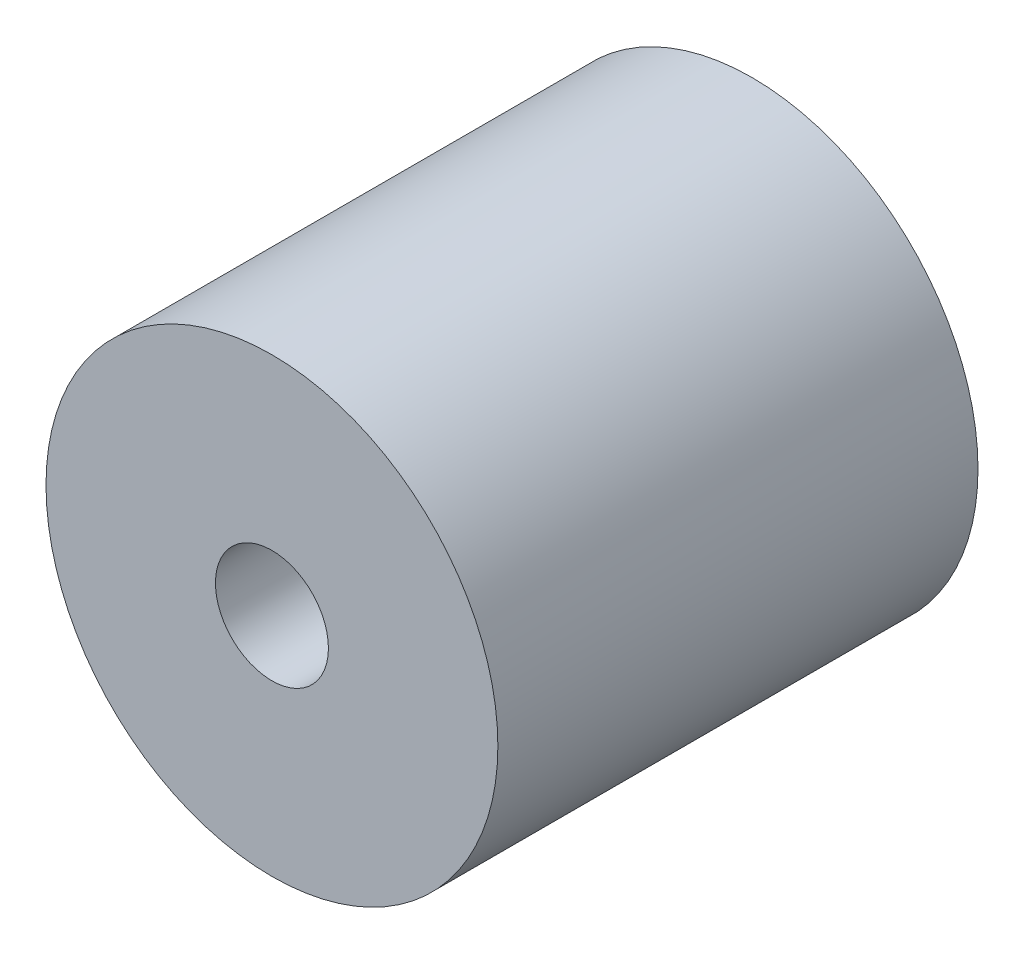
ISO-10303-21;
HEADER;
FILE_DESCRIPTION(('STEP AP214'),'2;1');
FILE_NAME('part.step','',(''),(''),'','','');
FILE_SCHEMA(('AUTOMOTIVE_DESIGN { 1 0 10303 214 1 1 1 1 }'));
ENDSEC;
DATA;
#1=APPLICATION_CONTEXT('core data for automotive mechanical design processes');
#2=APPLICATION_PROTOCOL_DEFINITION('international standard','automotive_design',2000,#1);
#3=PRODUCT_CONTEXT('',#1,'mechanical');
#4=PRODUCT('Part','Part','',(#3));
#5=PRODUCT_RELATED_PRODUCT_CATEGORY('part','',(#4));
#6=PRODUCT_DEFINITION_FORMATION('','',#4);
#7=PRODUCT_DEFINITION_CONTEXT('part definition',#1,'design');
#8=PRODUCT_DEFINITION('design','',#6,#7);
#9=PRODUCT_DEFINITION_SHAPE('','',#8);
#10=(LENGTH_UNIT() NAMED_UNIT(*) SI_UNIT(.MILLI.,.METRE.));
#11=(NAMED_UNIT(*) PLANE_ANGLE_UNIT() SI_UNIT($,.RADIAN.));
#12=(NAMED_UNIT(*) SI_UNIT($,.STERADIAN.) SOLID_ANGLE_UNIT());
#13=UNCERTAINTY_MEASURE_WITH_UNIT(LENGTH_MEASURE(1.E-05),#10,'distance_accuracy_value','');
#14=(GEOMETRIC_REPRESENTATION_CONTEXT(3) GLOBAL_UNCERTAINTY_ASSIGNED_CONTEXT((#13)) GLOBAL_UNIT_ASSIGNED_CONTEXT((#10,
#11,#12)) REPRESENTATION_CONTEXT('',''));
#15=CARTESIAN_POINT('',(0.,0.,0.));
#16=DIRECTION('',(0.,0.,1.));
#17=DIRECTION('',(1.,0.,0.));
#18=AXIS2_PLACEMENT_3D('',#15,#16,#17);
#19=CARTESIAN_POINT('',(0.,0.,8.5));
#20=DIRECTION('',(0.,0.,-1.));
#21=DIRECTION('',(-1.,0.,0.));
#22=AXIS2_PLACEMENT_3D('',#19,#20,#21);
#23=CYLINDRICAL_SURFACE('',#22,4.);
#24=CARTESIAN_POINT('',(0.,0.,8.5));
#25=DIRECTION('',(0.,0.,1.));
#26=DIRECTION('',(1.,0.,0.));
#27=AXIS2_PLACEMENT_3D('',#24,#25,#26);
#28=CIRCLE('',#27,4.);
#29=CARTESIAN_POINT('',(4.,0.,8.5));
#30=VERTEX_POINT('',#29);
#31=EDGE_CURVE('E10',#30,#30,#28,.T.);
#32=ORIENTED_EDGE('',*,*,#31,.F.);
#33=EDGE_LOOP('',(#32));
#34=FACE_BOUND('',#33,.T.);
#35=CARTESIAN_POINT('',(0.,0.,0.));
#36=DIRECTION('',(0.,0.,1.));
#37=DIRECTION('',(1.,0.,0.));
#38=AXIS2_PLACEMENT_3D('',#35,#36,#37);
#39=CIRCLE('',#38,4.);
#40=CARTESIAN_POINT('',(4.,0.,0.));
#41=VERTEX_POINT('',#40);
#42=EDGE_CURVE('E34',#41,#41,#39,.T.);
#43=ORIENTED_EDGE('',*,*,#42,.T.);
#44=EDGE_LOOP('',(#43));
#45=FACE_BOUND('',#44,.T.);
#46=ADVANCED_FACE('F31',(#34,#45),#23,.T.);
#47=CARTESIAN_POINT('',(0.,0.,8.5));
#48=DIRECTION('',(0.,0.,1.));
#49=DIRECTION('',(1.,0.,0.));
#50=AXIS2_PLACEMENT_3D('',#47,#48,#49);
#51=PLANE('',#50);
#52=CARTESIAN_POINT('',(0.,0.,8.5));
#53=DIRECTION('',(0.,0.,1.));
#54=DIRECTION('',(1.,0.,0.));
#55=AXIS2_PLACEMENT_3D('',#52,#53,#54);
#56=CIRCLE('',#55,1.);
#57=CARTESIAN_POINT('',(1.,0.,8.5));
#58=VERTEX_POINT('',#57);
#59=EDGE_CURVE('E43',#58,#58,#56,.T.);
#60=ORIENTED_EDGE('',*,*,#59,.F.);
#61=EDGE_LOOP('',(#60));
#62=FACE_BOUND('',#61,.T.);
#63=ORIENTED_EDGE('',*,*,#31,.T.);
#64=EDGE_LOOP('',(#63));
#65=FACE_BOUND('',#64,.T.);
#66=ADVANCED_FACE('F58',(#62,#65),#51,.T.);
#67=CARTESIAN_POINT('',(0.,0.,0.));
#68=DIRECTION('',(0.,0.,1.));
#69=DIRECTION('',(1.,0.,0.));
#70=AXIS2_PLACEMENT_3D('',#67,#68,#69);
#71=PLANE('',#70);
#72=CARTESIAN_POINT('',(0.,0.,0.));
#73=DIRECTION('',(0.,0.,1.));
#74=DIRECTION('',(1.,0.,0.));
#75=AXIS2_PLACEMENT_3D('',#72,#73,#74);
#76=CIRCLE('',#75,1.);
#77=CARTESIAN_POINT('',(1.,0.,0.));
#78=VERTEX_POINT('',#77);
#79=EDGE_CURVE('E41',#78,#78,#76,.T.);
#80=ORIENTED_EDGE('',*,*,#79,.T.);
#81=EDGE_LOOP('',(#80));
#82=FACE_BOUND('',#81,.T.);
#83=ORIENTED_EDGE('',*,*,#42,.F.);
#84=EDGE_LOOP('',(#83));
#85=FACE_BOUND('',#84,.T.);
#86=ADVANCED_FACE('F49',(#82,#85),#71,.F.);
#87=CARTESIAN_POINT('',(0.,0.,0.));
#88=DIRECTION('',(0.,0.,1.));
#89=DIRECTION('',(1.,0.,0.));
#90=AXIS2_PLACEMENT_3D('',#87,#88,#89);
#91=CYLINDRICAL_SURFACE('',#90,1.);
#92=ORIENTED_EDGE('',*,*,#79,.F.);
#93=EDGE_LOOP('',(#92));
#94=FACE_BOUND('',#93,.T.);
#95=ORIENTED_EDGE('',*,*,#59,.T.);
#96=EDGE_LOOP('',(#95));
#97=FACE_BOUND('',#96,.T.);
#98=ADVANCED_FACE('F52',(#94,#97),#91,.F.);
#99=CLOSED_SHELL('',(#46,#66,#86,#98));
#100=MANIFOLD_SOLID_BREP('B2',#99);
#101=ADVANCED_BREP_SHAPE_REPRESENTATION('',(#18,#100),#14);
#102=SHAPE_DEFINITION_REPRESENTATION(#9,#101);
ENDSEC;
END-ISO-10303-21;
